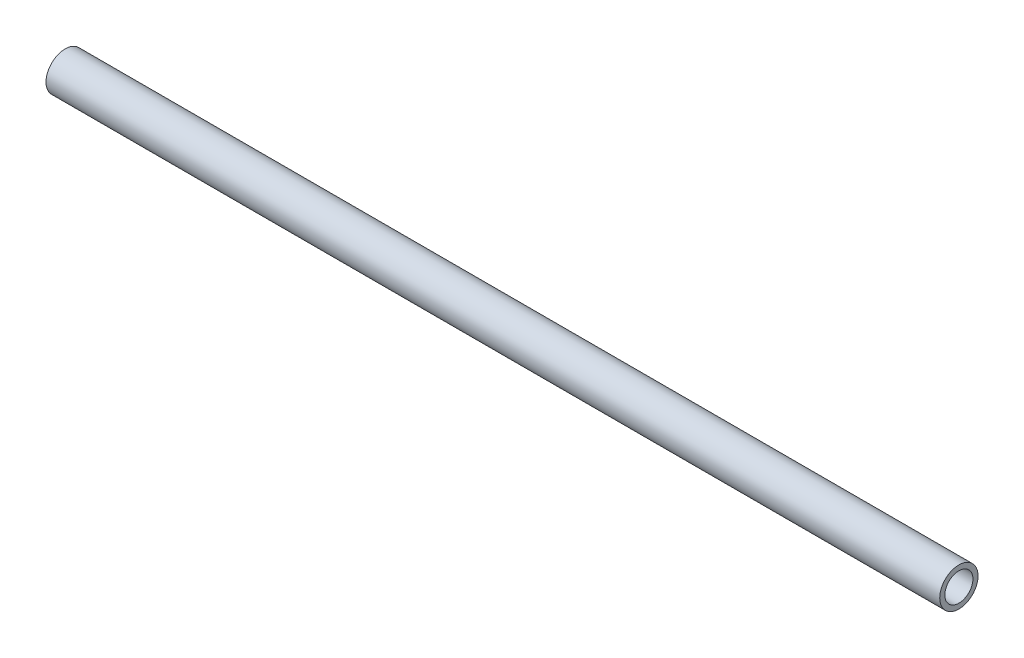
ISO-10303-21;
HEADER;
FILE_DESCRIPTION(('STEP AP214'),'2;1');
FILE_NAME('part.step','',(''),(''),'','','');
FILE_SCHEMA(('AUTOMOTIVE_DESIGN { 1 0 10303 214 1 1 1 1 }'));
ENDSEC;
DATA;
#1=APPLICATION_CONTEXT('core data for automotive mechanical design processes');
#2=APPLICATION_PROTOCOL_DEFINITION('international standard','automotive_design',2000,#1);
#3=PRODUCT_CONTEXT('',#1,'mechanical');
#4=PRODUCT('Part','Part','',(#3));
#5=PRODUCT_RELATED_PRODUCT_CATEGORY('part','',(#4));
#6=PRODUCT_DEFINITION_FORMATION('','',#4);
#7=PRODUCT_DEFINITION_CONTEXT('part definition',#1,'design');
#8=PRODUCT_DEFINITION('design','',#6,#7);
#9=PRODUCT_DEFINITION_SHAPE('','',#8);
#10=(LENGTH_UNIT() NAMED_UNIT(*) SI_UNIT(.MILLI.,.METRE.));
#11=(NAMED_UNIT(*) PLANE_ANGLE_UNIT() SI_UNIT($,.RADIAN.));
#12=(NAMED_UNIT(*) SI_UNIT($,.STERADIAN.) SOLID_ANGLE_UNIT());
#13=UNCERTAINTY_MEASURE_WITH_UNIT(LENGTH_MEASURE(1.E-05),#10,'distance_accuracy_value','');
#14=(GEOMETRIC_REPRESENTATION_CONTEXT(3) GLOBAL_UNCERTAINTY_ASSIGNED_CONTEXT((#13)) GLOBAL_UNIT_ASSIGNED_CONTEXT((#10,
#11,#12)) REPRESENTATION_CONTEXT('',''));
#15=CARTESIAN_POINT('',(0.,0.,0.));
#16=DIRECTION('',(0.,0.,1.));
#17=DIRECTION('',(1.,0.,0.));
#18=AXIS2_PLACEMENT_3D('',#15,#16,#17);
#19=CARTESIAN_POINT('',(13.7,2.25,0.));
#20=DIRECTION('',(1.,0.,0.));
#21=DIRECTION('',(0.,0.,-1.));
#22=AXIS2_PLACEMENT_3D('',#19,#20,#21);
#23=PLANE('',#22);
#24=CARTESIAN_POINT('',(13.7,0.,0.));
#25=DIRECTION('',(-1.,0.,0.));
#26=DIRECTION('',(0.,0.,1.));
#27=AXIS2_PLACEMENT_3D('',#24,#25,#26);
#28=CIRCLE('',#27,1.65);
#29=CARTESIAN_POINT('',(13.7,0.,1.65));
#30=VERTEX_POINT('',#29);
#31=EDGE_CURVE('E10',#30,#30,#28,.T.);
#32=ORIENTED_EDGE('',*,*,#31,.F.);
#33=EDGE_LOOP('',(#32));
#34=FACE_BOUND('',#33,.T.);
#35=CARTESIAN_POINT('',(13.7,0.,0.));
#36=DIRECTION('',(-1.,0.,0.));
#37=DIRECTION('',(0.,0.,1.));
#38=AXIS2_PLACEMENT_3D('',#35,#36,#37);
#39=CIRCLE('',#38,2.25);
#40=CARTESIAN_POINT('',(13.7,0.,2.25));
#41=VERTEX_POINT('',#40);
#42=EDGE_CURVE('E45',#41,#41,#39,.T.);
#43=ORIENTED_EDGE('',*,*,#42,.T.);
#44=EDGE_LOOP('',(#43));
#45=FACE_BOUND('',#44,.T.);
#46=ADVANCED_FACE('F31',(#34,#45),#23,.F.);
#47=CARTESIAN_POINT('',(-110.,0.,0.));
#48=DIRECTION('',(-1.,0.,0.));
#49=DIRECTION('',(0.,0.,1.));
#50=AXIS2_PLACEMENT_3D('',#47,#48,#49);
#51=CYLINDRICAL_SURFACE('',#50,1.65);
#52=CARTESIAN_POINT('',(118.7,0.,0.));
#53=DIRECTION('',(-1.,0.,0.));
#54=DIRECTION('',(0.,0.,1.));
#55=AXIS2_PLACEMENT_3D('',#52,#53,#54);
#56=CIRCLE('',#55,1.65);
#57=CARTESIAN_POINT('',(118.7,0.,1.65));
#58=VERTEX_POINT('',#57);
#59=EDGE_CURVE('E37',#58,#58,#56,.T.);
#60=ORIENTED_EDGE('',*,*,#59,.F.);
#61=EDGE_LOOP('',(#60));
#62=FACE_BOUND('',#61,.T.);
#63=ORIENTED_EDGE('',*,*,#31,.T.);
#64=EDGE_LOOP('',(#63));
#65=FACE_BOUND('',#64,.T.);
#66=ADVANCED_FACE('F60',(#62,#65),#51,.F.);
#67=CARTESIAN_POINT('',(118.7,1.65,0.));
#68=DIRECTION('',(-1.,0.,0.));
#69=DIRECTION('',(0.,0.,1.));
#70=AXIS2_PLACEMENT_3D('',#67,#68,#69);
#71=PLANE('',#70);
#72=CARTESIAN_POINT('',(118.7,0.,0.));
#73=DIRECTION('',(-1.,0.,0.));
#74=DIRECTION('',(0.,0.,1.));
#75=AXIS2_PLACEMENT_3D('',#72,#73,#74);
#76=CIRCLE('',#75,2.25);
#77=CARTESIAN_POINT('',(118.7,0.,2.25));
#78=VERTEX_POINT('',#77);
#79=EDGE_CURVE('E41',#78,#78,#76,.T.);
#80=ORIENTED_EDGE('',*,*,#79,.F.);
#81=EDGE_LOOP('',(#80));
#82=FACE_BOUND('',#81,.T.);
#83=ORIENTED_EDGE('',*,*,#59,.T.);
#84=EDGE_LOOP('',(#83));
#85=FACE_BOUND('',#84,.T.);
#86=ADVANCED_FACE('F55',(#82,#85),#71,.F.);
#87=CARTESIAN_POINT('',(-110.,0.,0.));
#88=DIRECTION('',(-1.,0.,0.));
#89=DIRECTION('',(0.,0.,1.));
#90=AXIS2_PLACEMENT_3D('',#87,#88,#89);
#91=CYLINDRICAL_SURFACE('',#90,2.25);
#92=ORIENTED_EDGE('',*,*,#42,.F.);
#93=EDGE_LOOP('',(#92));
#94=FACE_BOUND('',#93,.T.);
#95=ORIENTED_EDGE('',*,*,#79,.T.);
#96=EDGE_LOOP('',(#95));
#97=FACE_BOUND('',#96,.T.);
#98=ADVANCED_FACE('F52',(#94,#97),#91,.T.);
#99=CLOSED_SHELL('',(#46,#66,#86,#98));
#100=MANIFOLD_SOLID_BREP('B2',#99);
#101=ADVANCED_BREP_SHAPE_REPRESENTATION('',(#18,#100),#14);
#102=SHAPE_DEFINITION_REPRESENTATION(#9,#101);
ENDSEC;
END-ISO-10303-21;
